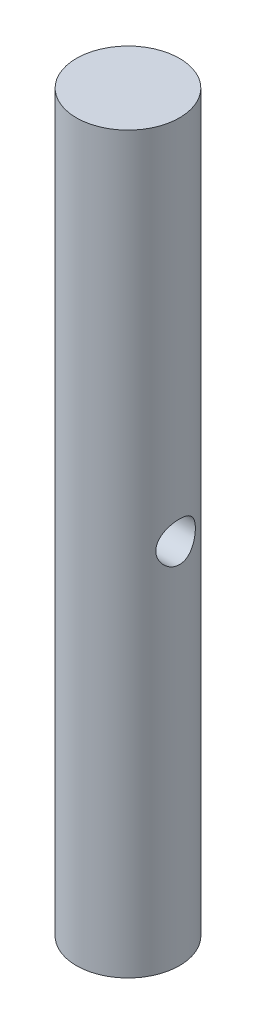
ISO-10303-21;
HEADER;
FILE_DESCRIPTION(('STEP AP214'),'2;1');
FILE_NAME('part.step','',(''),(''),'','','');
FILE_SCHEMA(('AUTOMOTIVE_DESIGN { 1 0 10303 214 1 1 1 1 }'));
ENDSEC;
DATA;
#1=APPLICATION_CONTEXT('core data for automotive mechanical design processes');
#2=APPLICATION_PROTOCOL_DEFINITION('international standard','automotive_design',2000,#1);
#3=PRODUCT_CONTEXT('',#1,'mechanical');
#4=PRODUCT('Part','Part','',(#3));
#5=PRODUCT_RELATED_PRODUCT_CATEGORY('part','',(#4));
#6=PRODUCT_DEFINITION_FORMATION('','',#4);
#7=PRODUCT_DEFINITION_CONTEXT('part definition',#1,'design');
#8=PRODUCT_DEFINITION('design','',#6,#7);
#9=PRODUCT_DEFINITION_SHAPE('','',#8);
#10=(LENGTH_UNIT() NAMED_UNIT(*) SI_UNIT(.MILLI.,.METRE.));
#11=(NAMED_UNIT(*) PLANE_ANGLE_UNIT() SI_UNIT($,.RADIAN.));
#12=(NAMED_UNIT(*) SI_UNIT($,.STERADIAN.) SOLID_ANGLE_UNIT());
#13=UNCERTAINTY_MEASURE_WITH_UNIT(LENGTH_MEASURE(1.E-05),#10,'distance_accuracy_value','');
#14=(GEOMETRIC_REPRESENTATION_CONTEXT(3) GLOBAL_UNCERTAINTY_ASSIGNED_CONTEXT((#13)) GLOBAL_UNIT_ASSIGNED_CONTEXT((#10,
#11,#12)) REPRESENTATION_CONTEXT('',''));
#15=CARTESIAN_POINT('',(0.,0.,0.));
#16=DIRECTION('',(0.,0.,1.));
#17=DIRECTION('',(1.,0.,0.));
#18=AXIS2_PLACEMENT_3D('',#15,#16,#17);
#19=CARTESIAN_POINT('',(0.,65.,0.));
#20=DIRECTION('',(0.,-1.,0.));
#21=DIRECTION('',(0.,0.,-1.));
#22=AXIS2_PLACEMENT_3D('',#19,#20,#21);
#23=CYLINDRICAL_SURFACE('',#22,4.5625);
#24=CARTESIAN_POINT('',(-4.5625,30.75,0.));
#25=CARTESIAN_POINT('',(-4.56250315999377,30.7499958478173,-0.0946193998558344));
#26=CARTESIAN_POINT('',(-4.55953135170847,30.7576975742007,-0.189211057181369));
#27=CARTESIAN_POINT('',(-4.54797432712696,30.7881694391545,-0.375559083890301));
#28=CARTESIAN_POINT('',(-4.53939020016596,30.8109366535665,-0.467315999870267));
#29=CARTESIAN_POINT('',(-4.51752739854011,30.8706101804453,-0.645279432072407));
#30=CARTESIAN_POINT('',(-4.50425803860522,30.907488450755,-0.731496562863782));
#31=CARTESIAN_POINT('',(-4.47433951671649,30.994191188608,-0.896511712922485));
#32=CARTESIAN_POINT('',(-4.45768940616811,31.0440192908063,-0.975307640793389));
#33=CARTESIAN_POINT('',(-4.42190012450887,31.1575008839003,-1.12672098000459));
#34=CARTESIAN_POINT('',(-4.40268829259218,31.2216254468475,-1.19896798448435));
#35=CARTESIAN_POINT('',(-4.36428988996312,31.3608796825881,-1.33198411966037));
#36=CARTESIAN_POINT('',(-4.34510332953896,31.4360129395089,-1.39274949744722));
#37=CARTESIAN_POINT('',(-4.30807189316266,31.5988343390055,-1.50348762661344));
#38=CARTESIAN_POINT('',(-4.29031204811765,31.6869059704,-1.55292783170618));
#39=CARTESIAN_POINT('',(-4.25928115791819,31.8709016013584,-1.63612861320744));
#40=CARTESIAN_POINT('',(-4.24600822608464,31.9668222793907,-1.66989578212407));
#41=CARTESIAN_POINT('',(-4.22623357636905,32.1595219863669,-1.71931423016104));
#42=CARTESIAN_POINT('',(-4.21946795365917,32.2560911149974,-1.73567471948652));
#43=CARTESIAN_POINT('',(-4.21270403035003,32.4508229197938,-1.75203235322385));
#44=CARTESIAN_POINT('',(-4.21270276651514,32.5489848793487,-1.75203666272176));
#45=CARTESIAN_POINT('',(-4.2192409897344,32.7375205758533,-1.7362224176468));
#46=CARTESIAN_POINT('',(-4.22536793123384,32.8279950270575,-1.72140185547026));
#47=CARTESIAN_POINT('',(-4.24278430801426,33.0050579888924,-1.67801319327525));
#48=CARTESIAN_POINT('',(-4.25407455789847,33.0916458839821,-1.64944292396004));
#49=CARTESIAN_POINT('',(-4.28078439201525,33.2604618617819,-1.5788395747246));
#50=CARTESIAN_POINT('',(-4.29628002467376,33.3425723813414,-1.53655543794506));
#51=CARTESIAN_POINT('',(-4.32963082238916,33.4988164829422,-1.43990001359164));
#52=CARTESIAN_POINT('',(-4.34748682706499,33.5729472093495,-1.38552442019175));
#53=CARTESIAN_POINT('',(-4.38508278991654,33.7166314057761,-1.2617139850173));
#54=CARTESIAN_POINT('',(-4.40486677390109,33.7854926866639,-1.1914872133226));
#55=CARTESIAN_POINT('',(-4.44301030623393,33.9106719647427,-1.04026012291817));
#56=CARTESIAN_POINT('',(-4.46136961464254,33.9669878520503,-0.959257995662898));
#57=CARTESIAN_POINT('',(-4.49499081506319,34.0662889142889,-0.786947782678473));
#58=CARTESIAN_POINT('',(-4.51019532151167,34.1090335532778,-0.695489077642846));
#59=CARTESIAN_POINT('',(-4.53536547835233,34.1782974573432,-0.505949575509956));
#60=CARTESIAN_POINT('',(-4.54533356726062,34.2048242757445,-0.407871884824333));
#61=CARTESIAN_POINT('',(-4.55847377630494,34.239545648046,-0.213696239439293));
#62=CARTESIAN_POINT('',(-4.56199079020614,34.2486716647856,-0.117788051128574));
#63=CARTESIAN_POINT('',(-4.56290531102336,34.2510574471785,0.0742433010303682));
#64=CARTESIAN_POINT('',(-4.56030424999573,34.2443209257719,0.17036640931069));
#65=CARTESIAN_POINT('',(-4.54950193678884,34.2158733730224,0.356007971175399));
#66=CARTESIAN_POINT('',(-4.54153222906839,34.1947811150972,0.445636151105738));
#67=CARTESIAN_POINT('',(-4.52102918396586,34.1390446697201,0.620011838357375));
#68=CARTESIAN_POINT('',(-4.50849525448631,34.1043987239613,0.70475871079425));
#69=CARTESIAN_POINT('',(-4.47962909554498,34.0214220395862,0.869805376685607));
#70=CARTESIAN_POINT('',(-4.46319463435709,33.9727136022005,0.949896849608648));
#71=CARTESIAN_POINT('',(-4.42833342859469,33.8634186746276,1.10104286511223));
#72=CARTESIAN_POINT('',(-4.40990592665401,33.8028276618349,1.17209394981681));
#73=CARTESIAN_POINT('',(-4.37169197715913,33.6671623722963,1.30766025033339));
#74=CARTESIAN_POINT('',(-4.35189096354067,33.5914319976631,1.37151650342372));
#75=CARTESIAN_POINT('',(-4.31422830750058,33.4299532245279,1.48575523434661));
#76=CARTESIAN_POINT('',(-4.29636688445791,33.3442036950737,1.53613618898556));
#77=CARTESIAN_POINT('',(-4.26464887730943,33.1642279205542,1.62212826037489));
#78=CARTESIAN_POINT('',(-4.25081644985725,33.0699548137026,1.65765082265606));
#79=CARTESIAN_POINT('',(-4.22919596411539,32.8760819627974,1.71206940853005));
#80=CARTESIAN_POINT('',(-4.22140392861977,32.776485769915,1.73097637351306));
#81=CARTESIAN_POINT('',(-4.21329061620127,32.5819709805019,1.75062582918549));
#82=CARTESIAN_POINT('',(-4.21250450343259,32.48718509378,1.75249869920657));
#83=CARTESIAN_POINT('',(-4.21729148280516,32.2987229399583,1.74094725436462));
#84=CARTESIAN_POINT('',(-4.22286391194241,32.2050465581995,1.72752453437014));
#85=CARTESIAN_POINT('',(-4.23934520927868,32.0246507830428,1.68665811643323));
#86=CARTESIAN_POINT('',(-4.25006952558712,31.9378035158248,1.65969795025959));
#87=CARTESIAN_POINT('',(-4.27553095331221,31.7698193996813,1.59295657706862));
#88=CARTESIAN_POINT('',(-4.29026910032706,31.6886840312767,1.55317206078647));
#89=CARTESIAN_POINT('',(-4.3230894374559,31.529648776773,1.45941581825135));
#90=CARTESIAN_POINT('',(-4.34130944824805,31.4521616983276,1.40479275874872));
#91=CARTESIAN_POINT('',(-4.37858515388105,31.3070935865737,1.28389895387295));
#92=CARTESIAN_POINT('',(-4.39764111894016,31.2395157875061,1.21762442108355));
#93=CARTESIAN_POINT('',(-4.43576153113081,31.1122037102329,1.07074603230087));
#94=CARTESIAN_POINT('',(-4.45476311595429,31.0531463385723,0.989536299599024));
#95=CARTESIAN_POINT('',(-4.48948732226387,30.9495230318614,0.817674008348717));
#96=CARTESIAN_POINT('',(-4.50520942641472,30.9049593825642,0.727019963345118));
#97=CARTESIAN_POINT('',(-4.53241116075287,30.8296207585853,0.532770487928135));
#98=CARTESIAN_POINT('',(-4.54356210834219,30.7998882433769,0.428719801232075));
#99=CARTESIAN_POINT('',(-4.55860267214449,30.7600857867856,0.216432385693808));
#100=CARTESIAN_POINT('',(-4.56249638652138,30.7500047480548,0.108198054629633));
#101=CARTESIAN_POINT('',(-4.5625,30.75,0.));
#102=B_SPLINE_CURVE_WITH_KNOTS('',3,(#24,#25,#26,#27,#28,#29,#30,#31,#32,#33,#34,#35,#36,#37,
#38,#39,#40,#41,#42,#43,#44,#45,#46,#47,#48,#49,#50,#51,#52,#53,#54,#55,#56,#57,#58,#59,#60,#61,
#62,#63,#64,#65,#66,#67,#68,#69,#70,#71,#72,#73,#74,#75,#76,#77,#78,#79,#80,#81,#82,#83,#84,#85,
#86,#87,#88,#89,#90,#91,#92,#93,#94,#95,#96,#97,#98,#99,#100,#101),.UNSPECIFIED.,.T.,.F.,(4,2,2,
2,2,2,2,2,2,2,2,2,2,2,2,2,2,2,2,2,2,2,2,2,2,2,2,2,2,2,2,2,2,2,2,2,2,2,4),(0.,0.28345893912343,
0.566862875994213,0.849706519815637,1.13262963581864,1.42680595553737,1.72107826465604,
2.02718939317461,2.33317164602523,2.62614409674835,2.91898820619098,3.19336149935763,
3.46777809470535,3.74753239048774,4.02738646811532,4.32698969675564,4.62664327467249,
4.93134452168216,5.23590374811294,5.52364438254941,5.81131767230559,6.0873169106701,
6.36335196602853,6.64762852176901,6.93201348621928,7.23366902881268,7.5353586549402,
7.83882154701034,8.1420844583529,8.42506303386599,8.7080121059514,8.98150579961907,
9.25507012365403,9.54344111318578,9.83190601420781,10.1370033378662,10.4421487540266,
10.7664695600496,11.0906071663678),.UNSPECIFIED.);
#103=CARTESIAN_POINT('',(-4.5625,30.75,0.));
#104=VERTEX_POINT('',#103);
#105=EDGE_CURVE('E11',#104,#104,#102,.T.);
#106=ORIENTED_EDGE('',*,*,#105,.T.);
#107=EDGE_LOOP('',(#106));
#108=FACE_BOUND('',#107,.T.);
#109=CARTESIAN_POINT('',(4.21353844767079,32.5,-1.75));
#110=CARTESIAN_POINT('',(4.21353426469015,32.4056709111821,-1.75000437012703));
#111=CARTESIAN_POINT('',(4.2167403863386,32.3113697999494,-1.74234794386491));
#112=CARTESIAN_POINT('',(4.22912275793327,32.1256211242876,-1.71207252577694));
#113=CARTESIAN_POINT('',(4.23829862093645,32.0341733753136,-1.68945450372107));
#114=CARTESIAN_POINT('',(4.26143139034844,31.856869809653,-1.63021638367242));
#115=CARTESIAN_POINT('',(4.2753763538924,31.7710006560743,-1.59363123603464));
#116=CARTESIAN_POINT('',(4.30645640823063,31.6065849202681,-1.5076219689594));
#117=CARTESIAN_POINT('',(4.32359250203079,31.5280406520103,-1.45819381089224));
#118=CARTESIAN_POINT('',(4.36012303914378,31.3764157734927,-1.34514637666422));
#119=CARTESIAN_POINT('',(4.37958599077059,31.3037698634235,-1.28096604532165));
#120=CARTESIAN_POINT('',(4.41800723601821,31.1699638032815,-1.14142500781839));
#121=CARTESIAN_POINT('',(4.43696541465824,31.1088062512195,-1.06606177960516));
#122=CARTESIAN_POINT('',(4.47306011547428,30.9975915323465,-0.902967901106714));
#123=CARTESIAN_POINT('',(4.49010702093582,30.9480106469328,-0.81489085802306));
#124=CARTESIAN_POINT('',(4.51963124019916,30.8645517417389,-0.630875887048278));
#125=CARTESIAN_POINT('',(4.5321102175574,30.8306680041462,-0.53494083650835));
#126=CARTESIAN_POINT('',(4.55060590519076,30.7811011570308,-0.342505823111501));
#127=CARTESIAN_POINT('',(4.55688772588136,30.7646688304012,-0.246224823997979));
#128=CARTESIAN_POINT('',(4.56323502143986,30.7480666366134,-0.0520805264038902));
#129=CARTESIAN_POINT('',(4.5633026111548,30.7478912368454,0.0457822224301437));
#130=CARTESIAN_POINT('',(4.55737999767425,30.7633801857488,0.234926797702884));
#131=CARTESIAN_POINT('',(4.5517029290094,30.7782257553944,0.326287206988993));
#132=CARTESIAN_POINT('',(4.5353434103855,30.821952753225,0.505105496324256));
#133=CARTESIAN_POINT('',(4.5246606043382,30.8508351799415,0.59256309825839));
#134=CARTESIAN_POINT('',(4.49914569664061,30.9221762420464,0.762629374834073));
#135=CARTESIAN_POINT('',(4.4842546762553,30.9648289781905,0.845147421233042));
#136=CARTESIAN_POINT('',(4.45182046978615,31.0623249085468,1.0020629054834));
#137=CARTESIAN_POINT('',(4.43427640824075,31.1171721295657,1.07645764876675));
#138=CARTESIAN_POINT('',(4.39707324933585,31.2414033410913,1.21982363903655));
#139=CARTESIAN_POINT('',(4.3773504147567,31.3114695066888,1.28818811884417));
#140=CARTESIAN_POINT('',(4.33885720429715,31.4621769155201,1.41243213365128));
#141=CARTESIAN_POINT('',(4.32008709198258,31.542821063222,1.46830822819508));
#142=CARTESIAN_POINT('',(4.28521200572184,31.7148957039155,1.56722376302432));
#143=CARTESIAN_POINT('',(4.2691823527205,31.8065396743103,1.60992056336777));
#144=CARTESIAN_POINT('',(4.24247740471053,31.9964946360663,1.6790417583217));
#145=CARTESIAN_POINT('',(4.23179896481747,32.0948016729129,1.70547571262037));
#146=CARTESIAN_POINT('',(4.21775448621019,32.289275167381,1.73990849869721));
#147=CARTESIAN_POINT('',(4.21400497646805,32.3852422121364,1.74887568560968));
#148=CARTESIAN_POINT('',(4.21315489133798,32.5773620338343,1.75092453163667));
#149=CARTESIAN_POINT('',(4.21605254123397,32.673514754355,1.74401043087386));
#150=CARTESIAN_POINT('',(4.22777941713886,32.858174781313,1.71537229366317));
#151=CARTESIAN_POINT('',(4.23630125512529,32.9468228165846,1.69441492207904));
#152=CARTESIAN_POINT('',(4.25794609228992,33.1192977177256,1.6392597783259));
#153=CARTESIAN_POINT('',(4.2710700603095,33.203123564098,1.60505921803984));
#154=CARTESIAN_POINT('',(4.3010621224403,33.3671742550056,1.52290768904938));
#155=CARTESIAN_POINT('',(4.31805512601363,33.4471354235317,1.47447715457526));
#156=CARTESIAN_POINT('',(4.35366730002909,33.5981383582596,1.36574381609178));
#157=CARTESIAN_POINT('',(4.37228708747726,33.6691767151008,1.30543649648822));
#158=CARTESIAN_POINT('',(4.41055903545588,33.8052483838594,1.16989348685709));
#159=CARTESIAN_POINT('',(4.4301969755156,33.8695625359117,1.09392922990952));
#160=CARTESIAN_POINT('',(4.4671066984165,33.9846252060597,0.931808249033244));
#161=CARTESIAN_POINT('',(4.4843784461865,34.0353735230962,0.84565137406709));
#162=CARTESIAN_POINT('',(4.51461827738346,34.1215738974394,0.665534607611917));
#163=CARTESIAN_POINT('',(4.52759693412159,34.1570636003596,0.571594610092389));
#164=CARTESIAN_POINT('',(4.54781021342542,34.2115251075501,0.378463350505621));
#165=CARTESIAN_POINT('',(4.5550476760988,34.2305050794581,0.279274710823462));
#166=CARTESIAN_POINT('',(4.56268249697152,34.250497552682,0.0849469781882643));
#167=CARTESIAN_POINT('',(4.56346812213421,34.2525300621387,-0.0100728124139927));
#168=CARTESIAN_POINT('',(4.55913537806539,34.2412171556098,-0.199045286362019));
#169=CARTESIAN_POINT('',(4.55401777753703,34.2278737418385,-0.292998107037268));
#170=CARTESIAN_POINT('',(4.53863678641089,34.1869092073605,-0.474636779892465));
#171=CARTESIAN_POINT('',(4.52851310856677,34.159675139897,-0.562422670060431));
#172=CARTESIAN_POINT('',(4.50418483903296,34.0920947183211,-0.732178732300492));
#173=CARTESIAN_POINT('',(4.48997947458692,34.0517458810937,-0.814147799447559));
#174=CARTESIAN_POINT('',(4.45814281138167,33.9571194651713,-0.973796432601916));
#175=CARTESIAN_POINT('',(4.4403907557622,33.9023189434163,-1.05114149165158));
#176=CARTESIAN_POINT('',(4.40362779088878,33.7811562383188,-1.19584781714496));
#177=CARTESIAN_POINT('',(4.38461642612356,33.7147898571157,-1.26320544213628));
#178=CARTESIAN_POINT('',(4.34617139164889,33.5679814075903,-1.38990264951542));
#179=CARTESIAN_POINT('',(4.32677336237689,33.486960515714,-1.44858500167701));
#180=CARTESIAN_POINT('',(4.29093198428771,33.3155988954797,-1.55154492377071));
#181=CARTESIAN_POINT('',(4.27448921194281,33.2252563541765,-1.59581968462358));
#182=CARTESIAN_POINT('',(4.24579484472439,33.0315834949898,-1.67073708712056));
#183=CARTESIAN_POINT('',(4.23387723808105,32.9277923696431,-1.70033081870156));
#184=CARTESIAN_POINT('',(4.21775432712552,32.7159864559497,-1.7399524330341));
#185=CARTESIAN_POINT('',(4.21354323576871,32.6079748991523,-1.74999499768278));
#186=CARTESIAN_POINT('',(4.21353844767079,32.5,-1.75));
#187=B_SPLINE_CURVE_WITH_KNOTS('',3,(#109,#110,#111,#112,#113,#114,#115,#116,#117,#118,#119,
#120,#121,#122,#123,#124,#125,#126,#127,#128,#129,#130,#131,#132,#133,#134,#135,#136,#137,#138,
#139,#140,#141,#142,#143,#144,#145,#146,#147,#148,#149,#150,#151,#152,#153,#154,#155,#156,#157,
#158,#159,#160,#161,#162,#163,#164,#165,#166,#167,#168,#169,#170,#171,#172,#173,#174,#175,#176,
#177,#178,#179,#180,#181,#182,#183,#184,#185,#186),.UNSPECIFIED.,.T.,.F.,(4,2,2,2,2,2,2,2,2,2,2,
2,2,2,2,2,2,2,2,2,2,2,2,2,2,2,2,2,2,2,2,2,2,2,2,2,2,2,4),(0.,0.282584730085384,
0.565151145591387,0.847015072752877,1.12896774270713,1.42426864168856,1.71963624069648,
2.02558764688039,2.33142752000434,2.62352874888701,2.9155305685733,3.19242975103589,
3.46934863399619,3.75035501752366,4.03145433187002,4.32968346552075,4.62799465804684,
4.93351095963843,5.23884749945155,5.52671177924023,5.81449921148328,6.0877324017131,
6.36102314761851,6.64485695091769,6.9287988778621,7.23172704216382,7.5346596959136,
7.83684061331932,8.1388719516526,8.42258321129188,8.70625753093743,8.98242728638986,
9.25864936156439,9.5467123514195,9.83488011311235,10.1391294175944,10.4434380067291,
10.7671451171129,11.0906090465891),.UNSPECIFIED.);
#188=CARTESIAN_POINT('',(4.21353844767079,32.5,-1.75));
#189=VERTEX_POINT('',#188);
#190=EDGE_CURVE('E56',#189,#189,#187,.T.);
#191=ORIENTED_EDGE('',*,*,#190,.T.);
#192=EDGE_LOOP('',(#191));
#193=FACE_BOUND('',#192,.T.);
#194=CARTESIAN_POINT('',(0.,65.,0.));
#195=DIRECTION('',(0.,1.,0.));
#196=DIRECTION('',(0.,0.,1.));
#197=AXIS2_PLACEMENT_3D('',#194,#195,#196);
#198=CIRCLE('',#197,4.5625);
#199=CARTESIAN_POINT('',(0.,65.,4.5625));
#200=VERTEX_POINT('',#199);
#201=EDGE_CURVE('E99',#200,#200,#198,.T.);
#202=ORIENTED_EDGE('',*,*,#201,.F.);
#203=EDGE_LOOP('',(#202));
#204=FACE_BOUND('',#203,.T.);
#205=CARTESIAN_POINT('',(0.,0.,0.));
#206=DIRECTION('',(0.,1.,0.));
#207=DIRECTION('',(0.,0.,1.));
#208=AXIS2_PLACEMENT_3D('',#205,#206,#207);
#209=CIRCLE('',#208,4.5625);
#210=CARTESIAN_POINT('',(0.,0.,4.5625));
#211=VERTEX_POINT('',#210);
#212=EDGE_CURVE('E80',#211,#211,#209,.T.);
#213=ORIENTED_EDGE('',*,*,#212,.T.);
#214=EDGE_LOOP('',(#213));
#215=FACE_BOUND('',#214,.T.);
#216=ADVANCED_FACE('F43',(#108,#193,#204,#215),#23,.T.);
#217=CARTESIAN_POINT('',(0.,65.,0.));
#218=DIRECTION('',(0.,1.,0.));
#219=DIRECTION('',(0.,0.,1.));
#220=AXIS2_PLACEMENT_3D('',#217,#218,#219);
#221=PLANE('',#220);
#222=ORIENTED_EDGE('',*,*,#201,.T.);
#223=EDGE_LOOP('',(#222));
#224=FACE_BOUND('',#223,.T.);
#225=ADVANCED_FACE('F117',(#224),#221,.T.);
#226=CARTESIAN_POINT('',(0.,0.,0.));
#227=DIRECTION('',(0.,1.,0.));
#228=DIRECTION('',(0.,0.,1.));
#229=AXIS2_PLACEMENT_3D('',#226,#227,#228);
#230=PLANE('',#229);
#231=DIRECTION('',(0.,0.,1.));
#232=VECTOR('',#231,1.);
#233=CARTESIAN_POINT('',(2.4558908770546,0.,2.315));
#234=LINE('',#233,#232);
#235=CARTESIAN_POINT('',(2.4558908770546,0.,-2.315));
#236=VERTEX_POINT('',#235);
#237=CARTESIAN_POINT('',(2.4558908770546,0.,2.315));
#238=VERTEX_POINT('',#237);
#239=EDGE_CURVE('E84',#236,#238,#234,.T.);
#240=ORIENTED_EDGE('',*,*,#239,.F.);
#241=CARTESIAN_POINT('',(0.,0.,0.));
#242=DIRECTION('',(0.,-1.,0.));
#243=DIRECTION('',(0.,0.,-1.));
#244=AXIS2_PLACEMENT_3D('',#241,#242,#243);
#245=CIRCLE('',#244,3.375);
#246=EDGE_CURVE('E63',#238,#236,#245,.T.);
#247=ORIENTED_EDGE('',*,*,#246,.F.);
#248=EDGE_LOOP('',(#240,#247));
#249=FACE_BOUND('',#248,.T.);
#250=ORIENTED_EDGE('',*,*,#212,.F.);
#251=EDGE_LOOP('',(#250));
#252=FACE_BOUND('',#251,.T.);
#253=ADVANCED_FACE('F89',(#249,#252),#230,.F.);
#254=CARTESIAN_POINT('',(-4.5625,32.5,0.));
#255=DIRECTION('',(1.,0.,0.));
#256=DIRECTION('',(0.,0.,-1.));
#257=AXIS2_PLACEMENT_3D('',#254,#255,#256);
#258=CYLINDRICAL_SURFACE('',#257,1.75);
#259=ORIENTED_EDGE('',*,*,#190,.F.);
#260=EDGE_LOOP('',(#259));
#261=FACE_BOUND('',#260,.T.);
#262=ORIENTED_EDGE('',*,*,#105,.F.);
#263=EDGE_LOOP('',(#262));
#264=FACE_BOUND('',#263,.T.);
#265=ADVANCED_FACE('F110',(#261,#264),#258,.F.);
#266=CARTESIAN_POINT('',(0.,23.5,0.));
#267=DIRECTION('',(0.,-1.,0.));
#268=DIRECTION('',(0.,0.,-1.));
#269=AXIS2_PLACEMENT_3D('',#266,#267,#268);
#270=CYLINDRICAL_SURFACE('',#269,3.375);
#271=ORIENTED_EDGE('',*,*,#246,.T.);
#272=DIRECTION('',(0.,-1.,0.));
#273=VECTOR('',#272,1.);
#274=CARTESIAN_POINT('',(2.4558908770546,23.5,-2.315));
#275=LINE('',#274,#273);
#276=CARTESIAN_POINT('',(2.4558908770546,23.5,-2.315));
#277=VERTEX_POINT('',#276);
#278=EDGE_CURVE('E81',#277,#236,#275,.T.);
#279=ORIENTED_EDGE('',*,*,#278,.F.);
#280=CARTESIAN_POINT('',(0.,23.5,0.));
#281=DIRECTION('',(0.,-1.,0.));
#282=DIRECTION('',(0.,0.,-1.));
#283=AXIS2_PLACEMENT_3D('',#280,#281,#282);
#284=CIRCLE('',#283,3.375);
#285=CARTESIAN_POINT('',(2.4558908770546,23.5,2.315));
#286=VERTEX_POINT('',#285);
#287=EDGE_CURVE('E77',#286,#277,#284,.T.);
#288=ORIENTED_EDGE('',*,*,#287,.F.);
#289=DIRECTION('',(0.,-1.,0.));
#290=VECTOR('',#289,1.);
#291=CARTESIAN_POINT('',(2.4558908770546,23.5,2.315));
#292=LINE('',#291,#290);
#293=EDGE_CURVE('E71',#286,#238,#292,.T.);
#294=ORIENTED_EDGE('',*,*,#293,.T.);
#295=EDGE_LOOP('',(#271,#279,#288,#294));
#296=FACE_BOUND('',#295,.T.);
#297=ADVANCED_FACE('F75',(#296),#270,.F.);
#298=CARTESIAN_POINT('',(2.4558908770546,23.5,2.315));
#299=DIRECTION('',(1.,0.,0.));
#300=DIRECTION('',(0.,0.,-1.));
#301=AXIS2_PLACEMENT_3D('',#298,#299,#300);
#302=PLANE('',#301);
#303=ORIENTED_EDGE('',*,*,#239,.T.);
#304=ORIENTED_EDGE('',*,*,#293,.F.);
#305=DIRECTION('',(0.,0.,1.));
#306=VECTOR('',#305,1.);
#307=CARTESIAN_POINT('',(2.4558908770546,23.5,2.315));
#308=LINE('',#307,#306);
#309=EDGE_CURVE('E94',#277,#286,#308,.T.);
#310=ORIENTED_EDGE('',*,*,#309,.F.);
#311=ORIENTED_EDGE('',*,*,#278,.T.);
#312=EDGE_LOOP('',(#303,#304,#310,#311));
#313=FACE_BOUND('',#312,.T.);
#314=ADVANCED_FACE('F85',(#313),#302,.F.);
#315=CARTESIAN_POINT('',(0.,23.5,0.));
#316=DIRECTION('',(0.,-1.,0.));
#317=DIRECTION('',(0.,0.,-1.));
#318=AXIS2_PLACEMENT_3D('',#315,#316,#317);
#319=PLANE('',#318);
#320=ORIENTED_EDGE('',*,*,#287,.T.);
#321=ORIENTED_EDGE('',*,*,#309,.T.);
#322=EDGE_LOOP('',(#320,#321));
#323=FACE_BOUND('',#322,.T.);
#324=ADVANCED_FACE('F177',(#323),#319,.T.);
#325=CLOSED_SHELL('',(#216,#225,#253,#265,#297,#314,#324));
#326=MANIFOLD_SOLID_BREP('B2',#325);
#327=ADVANCED_BREP_SHAPE_REPRESENTATION('',(#18,#326),#14);
#328=SHAPE_DEFINITION_REPRESENTATION(#9,#327);
ENDSEC;
END-ISO-10303-21;
